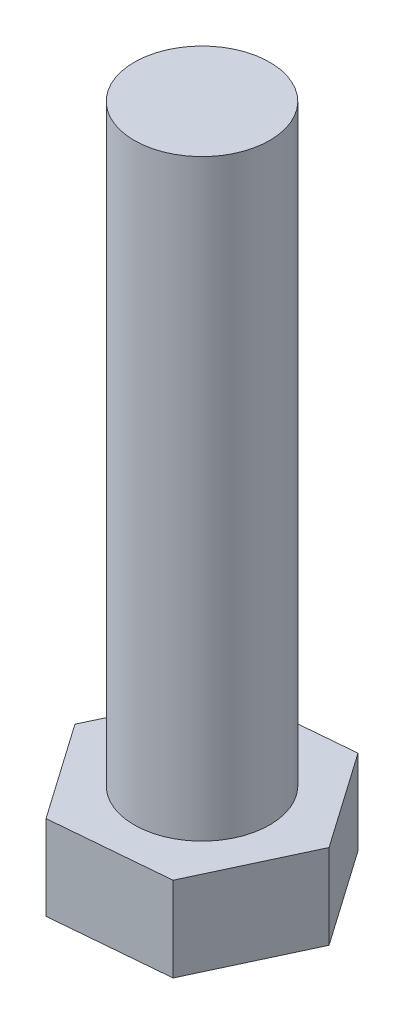
ISO-10303-21;
HEADER;
FILE_DESCRIPTION(('STEP AP214'),'2;1');
FILE_NAME('part.step','',(''),(''),'','','');
FILE_SCHEMA(('AUTOMOTIVE_DESIGN { 1 0 10303 214 1 1 1 1 }'));
ENDSEC;
DATA;
#1=APPLICATION_CONTEXT('core data for automotive mechanical design processes');
#2=APPLICATION_PROTOCOL_DEFINITION('international standard','automotive_design',2000,#1);
#3=PRODUCT_CONTEXT('',#1,'mechanical');
#4=PRODUCT('Part','Part','',(#3));
#5=PRODUCT_RELATED_PRODUCT_CATEGORY('part','',(#4));
#6=PRODUCT_DEFINITION_FORMATION('','',#4);
#7=PRODUCT_DEFINITION_CONTEXT('part definition',#1,'design');
#8=PRODUCT_DEFINITION('design','',#6,#7);
#9=PRODUCT_DEFINITION_SHAPE('','',#8);
#10=(LENGTH_UNIT() NAMED_UNIT(*) SI_UNIT(.MILLI.,.METRE.));
#11=(NAMED_UNIT(*) PLANE_ANGLE_UNIT() SI_UNIT($,.RADIAN.));
#12=(NAMED_UNIT(*) SI_UNIT($,.STERADIAN.) SOLID_ANGLE_UNIT());
#13=UNCERTAINTY_MEASURE_WITH_UNIT(LENGTH_MEASURE(1.E-05),#10,'distance_accuracy_value','');
#14=(GEOMETRIC_REPRESENTATION_CONTEXT(3) GLOBAL_UNCERTAINTY_ASSIGNED_CONTEXT((#13)) GLOBAL_UNIT_ASSIGNED_CONTEXT((#10,
#11,#12)) REPRESENTATION_CONTEXT('',''));
#15=CARTESIAN_POINT('',(0.,0.,0.));
#16=DIRECTION('',(0.,0.,1.));
#17=DIRECTION('',(1.,0.,0.));
#18=AXIS2_PLACEMENT_3D('',#15,#16,#17);
#19=CARTESIAN_POINT('',(-2.93212988476985,5.,6.27715017654027));
#20=DIRECTION('',(-0.0864980574249232,0.,-0.996252019351386));
#21=DIRECTION('',(-0.996252019351386,0.,0.0864980574249232));
#22=AXIS2_PLACEMENT_3D('',#19,#20,#21);
#23=PLANE('',#22);
#24=DIRECTION('',(0.996252019351386,0.,-0.0864980574249232));
#25=VECTOR('',#24,1.);
#26=CARTESIAN_POINT('',(-2.93212988476985,0.,6.27715017654027));
#27=LINE('',#26,#25);
#28=CARTESIAN_POINT('',(-2.93212988476985,0.,6.27715017654027));
#29=VERTEX_POINT('',#28);
#30=CARTESIAN_POINT('',(3.97010657386892,0.,5.67787405567636));
#31=VERTEX_POINT('',#30);
#32=EDGE_CURVE('E116',#29,#31,#27,.T.);
#33=ORIENTED_EDGE('',*,*,#32,.T.);
#34=DIRECTION('',(0.,-1.,0.));
#35=VECTOR('',#34,1.);
#36=CARTESIAN_POINT('',(3.97010657386892,5.,5.67787405567636));
#37=LINE('',#36,#35);
#38=CARTESIAN_POINT('',(3.97010657386892,5.,5.67787405567636));
#39=VERTEX_POINT('',#38);
#40=EDGE_CURVE('E11',#39,#31,#37,.T.);
#41=ORIENTED_EDGE('',*,*,#40,.F.);
#42=DIRECTION('',(0.996252019351386,0.,-0.0864980574249232));
#43=VECTOR('',#42,1.);
#44=CARTESIAN_POINT('',(-2.93212988476985,5.,6.27715017654027));
#45=LINE('',#44,#43);
#46=CARTESIAN_POINT('',(-2.93212988476985,5.,6.27715017654027));
#47=VERTEX_POINT('',#46);
#48=EDGE_CURVE('E127',#47,#39,#45,.T.);
#49=ORIENTED_EDGE('',*,*,#48,.F.);
#50=DIRECTION('',(0.,-1.,0.));
#51=VECTOR('',#50,1.);
#52=CARTESIAN_POINT('',(-2.93212988476985,5.,6.27715017654027));
#53=LINE('',#52,#51);
#54=EDGE_CURVE('E112',#47,#29,#53,.T.);
#55=ORIENTED_EDGE('',*,*,#54,.T.);
#56=EDGE_LOOP('',(#33,#41,#49,#55));
#57=FACE_BOUND('',#56,.T.);
#58=ADVANCED_FACE('F32',(#57),#23,.F.);
#59=CARTESIAN_POINT('',(3.97010657386892,5.,5.67787405567636));
#60=DIRECTION('',(-0.906028586042308,0.,-0.423216494567705));
#61=DIRECTION('',(-0.423216494567705,0.,0.906028586042308));
#62=AXIS2_PLACEMENT_3D('',#59,#60,#61);
#63=PLANE('',#62);
#64=DIRECTION('',(0.423216494567705,0.,-0.906028586042308));
#65=VECTOR('',#64,1.);
#66=CARTESIAN_POINT('',(3.97010657386892,0.,5.67787405567636));
#67=LINE('',#66,#65);
#68=CARTESIAN_POINT('',(6.90223645863877,0.,-0.599276120863908));
#69=VERTEX_POINT('',#68);
#70=EDGE_CURVE('E119',#31,#69,#67,.T.);
#71=ORIENTED_EDGE('',*,*,#70,.T.);
#72=DIRECTION('',(0.,-1.,0.));
#73=VECTOR('',#72,1.);
#74=CARTESIAN_POINT('',(6.90223645863877,5.,-0.599276120863908));
#75=LINE('',#74,#73);
#76=CARTESIAN_POINT('',(6.90223645863877,5.,-0.599276120863908));
#77=VERTEX_POINT('',#76);
#78=EDGE_CURVE('E40',#77,#69,#75,.T.);
#79=ORIENTED_EDGE('',*,*,#78,.F.);
#80=DIRECTION('',(0.423216494567705,0.,-0.906028586042308));
#81=VECTOR('',#80,1.);
#82=CARTESIAN_POINT('',(3.97010657386892,5.,5.67787405567636));
#83=LINE('',#82,#81);
#84=EDGE_CURVE('E85',#39,#77,#83,.T.);
#85=ORIENTED_EDGE('',*,*,#84,.F.);
#86=ORIENTED_EDGE('',*,*,#40,.T.);
#87=EDGE_LOOP('',(#71,#79,#85,#86));
#88=FACE_BOUND('',#87,.T.);
#89=ADVANCED_FACE('F152',(#88),#63,.F.);
#90=CARTESIAN_POINT('',(6.90223645863877,5.,-0.599276120863908));
#91=DIRECTION('',(-0.819530528617385,0.,0.573035524783682));
#92=DIRECTION('',(0.573035524783682,0.,0.819530528617385));
#93=AXIS2_PLACEMENT_3D('',#90,#91,#92);
#94=PLANE('',#93);
#95=DIRECTION('',(-0.573035524783682,0.,-0.819530528617385));
#96=VECTOR('',#95,1.);
#97=CARTESIAN_POINT('',(6.90223645863877,0.,-0.599276120863908));
#98=LINE('',#97,#96);
#99=CARTESIAN_POINT('',(2.93212988476985,0.,-6.27715017654027));
#100=VERTEX_POINT('',#99);
#101=EDGE_CURVE('E122',#69,#100,#98,.T.);
#102=ORIENTED_EDGE('',*,*,#101,.T.);
#103=DIRECTION('',(0.,-1.,0.));
#104=VECTOR('',#103,1.);
#105=CARTESIAN_POINT('',(2.93212988476985,5.,-6.27715017654027));
#106=LINE('',#105,#104);
#107=CARTESIAN_POINT('',(2.93212988476985,5.,-6.27715017654027));
#108=VERTEX_POINT('',#107);
#109=EDGE_CURVE('E107',#108,#100,#106,.T.);
#110=ORIENTED_EDGE('',*,*,#109,.F.);
#111=DIRECTION('',(-0.573035524783682,0.,-0.819530528617385));
#112=VECTOR('',#111,1.);
#113=CARTESIAN_POINT('',(6.90223645863877,5.,-0.599276120863908));
#114=LINE('',#113,#112);
#115=EDGE_CURVE('E98',#77,#108,#114,.T.);
#116=ORIENTED_EDGE('',*,*,#115,.F.);
#117=ORIENTED_EDGE('',*,*,#78,.T.);
#118=EDGE_LOOP('',(#102,#110,#116,#117));
#119=FACE_BOUND('',#118,.T.);
#120=ADVANCED_FACE('F133',(#119),#94,.F.);
#121=CARTESIAN_POINT('',(2.93212988476985,5.,-6.27715017654027));
#122=DIRECTION('',(0.0864980574249229,0.,0.996252019351386));
#123=DIRECTION('',(0.996252019351386,0.,-0.0864980574249229));
#124=AXIS2_PLACEMENT_3D('',#121,#122,#123);
#125=PLANE('',#124);
#126=DIRECTION('',(-0.996252019351386,0.,0.0864980574249229));
#127=VECTOR('',#126,1.);
#128=CARTESIAN_POINT('',(2.93212988476985,0.,-6.27715017654027));
#129=LINE('',#128,#127);
#130=CARTESIAN_POINT('',(-3.97010657386892,0.,-5.67787405567636));
#131=VERTEX_POINT('',#130);
#132=EDGE_CURVE('E106',#100,#131,#129,.T.);
#133=ORIENTED_EDGE('',*,*,#132,.T.);
#134=DIRECTION('',(0.,-1.,0.));
#135=VECTOR('',#134,1.);
#136=CARTESIAN_POINT('',(-3.97010657386892,5.,-5.67787405567636));
#137=LINE('',#136,#135);
#138=CARTESIAN_POINT('',(-3.97010657386892,5.,-5.67787405567636));
#139=VERTEX_POINT('',#138);
#140=EDGE_CURVE('E103',#139,#131,#137,.T.);
#141=ORIENTED_EDGE('',*,*,#140,.F.);
#142=DIRECTION('',(-0.996252019351386,0.,0.0864980574249229));
#143=VECTOR('',#142,1.);
#144=CARTESIAN_POINT('',(2.93212988476985,5.,-6.27715017654027));
#145=LINE('',#144,#143);
#146=EDGE_CURVE('E92',#108,#139,#145,.T.);
#147=ORIENTED_EDGE('',*,*,#146,.F.);
#148=ORIENTED_EDGE('',*,*,#109,.T.);
#149=EDGE_LOOP('',(#133,#141,#147,#148));
#150=FACE_BOUND('',#149,.T.);
#151=ADVANCED_FACE('F104',(#150),#125,.F.);
#152=CARTESIAN_POINT('',(-3.97010657386892,5.,-5.67787405567636));
#153=DIRECTION('',(0.906028586042308,0.,0.423216494567705));
#154=DIRECTION('',(0.423216494567705,0.,-0.906028586042308));
#155=AXIS2_PLACEMENT_3D('',#152,#153,#154);
#156=PLANE('',#155);
#157=DIRECTION('',(-0.423216494567705,0.,0.906028586042308));
#158=VECTOR('',#157,1.);
#159=CARTESIAN_POINT('',(-3.97010657386892,0.,-5.67787405567636));
#160=LINE('',#159,#158);
#161=CARTESIAN_POINT('',(-6.90223645863877,0.,0.599276120863908));
#162=VERTEX_POINT('',#161);
#163=EDGE_CURVE('E71',#131,#162,#160,.T.);
#164=ORIENTED_EDGE('',*,*,#163,.T.);
#165=DIRECTION('',(0.,-1.,0.));
#166=VECTOR('',#165,1.);
#167=CARTESIAN_POINT('',(-6.90223645863877,5.,0.599276120863908));
#168=LINE('',#167,#166);
#169=CARTESIAN_POINT('',(-6.90223645863877,5.,0.599276120863908));
#170=VERTEX_POINT('',#169);
#171=EDGE_CURVE('E108',#170,#162,#168,.T.);
#172=ORIENTED_EDGE('',*,*,#171,.F.);
#173=DIRECTION('',(-0.423216494567705,0.,0.906028586042308));
#174=VECTOR('',#173,1.);
#175=CARTESIAN_POINT('',(-3.97010657386892,5.,-5.67787405567636));
#176=LINE('',#175,#174);
#177=EDGE_CURVE('E96',#139,#170,#176,.T.);
#178=ORIENTED_EDGE('',*,*,#177,.F.);
#179=ORIENTED_EDGE('',*,*,#140,.T.);
#180=EDGE_LOOP('',(#164,#172,#178,#179));
#181=FACE_BOUND('',#180,.T.);
#182=ADVANCED_FACE('F110',(#181),#156,.F.);
#183=CARTESIAN_POINT('',(-6.90223645863877,5.,0.599276120863908));
#184=DIRECTION('',(0.819530528617385,0.,-0.573035524783682));
#185=DIRECTION('',(-0.573035524783682,0.,-0.819530528617385));
#186=AXIS2_PLACEMENT_3D('',#183,#184,#185);
#187=PLANE('',#186);
#188=DIRECTION('',(0.573035524783681,0.,0.819530528617385));
#189=VECTOR('',#188,1.);
#190=CARTESIAN_POINT('',(-6.90223645863877,0.,0.599276120863908));
#191=LINE('',#190,#189);
#192=EDGE_CURVE('E77',#162,#29,#191,.T.);
#193=ORIENTED_EDGE('',*,*,#192,.T.);
#194=ORIENTED_EDGE('',*,*,#54,.F.);
#195=DIRECTION('',(0.573035524783681,0.,0.819530528617385));
#196=VECTOR('',#195,1.);
#197=CARTESIAN_POINT('',(-6.90223645863877,5.,0.599276120863908));
#198=LINE('',#197,#196);
#199=EDGE_CURVE('E48',#170,#47,#198,.T.);
#200=ORIENTED_EDGE('',*,*,#199,.F.);
#201=ORIENTED_EDGE('',*,*,#171,.T.);
#202=EDGE_LOOP('',(#193,#194,#200,#201));
#203=FACE_BOUND('',#202,.T.);
#204=ADVANCED_FACE('F140',(#203),#187,.F.);
#205=CARTESIAN_POINT('',(0.,5.,0.));
#206=DIRECTION('',(0.,1.,0.));
#207=DIRECTION('',(0.,0.,1.));
#208=AXIS2_PLACEMENT_3D('',#205,#206,#207);
#209=PLANE('',#208);
#210=CARTESIAN_POINT('',(0.,5.,0.));
#211=DIRECTION('',(0.,1.,0.));
#212=DIRECTION('',(0.,0.,1.));
#213=AXIS2_PLACEMENT_3D('',#210,#211,#212);
#214=CIRCLE('',#213,4.);
#215=CARTESIAN_POINT('',(0.,5.,4.));
#216=VERTEX_POINT('',#215);
#217=EDGE_CURVE('E213',#216,#216,#214,.T.);
#218=ORIENTED_EDGE('',*,*,#217,.F.);
#219=EDGE_LOOP('',(#218));
#220=FACE_BOUND('',#219,.T.);
#221=ORIENTED_EDGE('',*,*,#48,.T.);
#222=ORIENTED_EDGE('',*,*,#84,.T.);
#223=ORIENTED_EDGE('',*,*,#115,.T.);
#224=ORIENTED_EDGE('',*,*,#146,.T.);
#225=ORIENTED_EDGE('',*,*,#177,.T.);
#226=ORIENTED_EDGE('',*,*,#199,.T.);
#227=EDGE_LOOP('',(#221,#222,#223,#224,#225,#226));
#228=FACE_BOUND('',#227,.T.);
#229=ADVANCED_FACE('F94',(#220,#228),#209,.T.);
#230=CARTESIAN_POINT('',(0.,0.,0.));
#231=DIRECTION('',(0.,1.,0.));
#232=DIRECTION('',(0.,0.,1.));
#233=AXIS2_PLACEMENT_3D('',#230,#231,#232);
#234=PLANE('',#233);
#235=ORIENTED_EDGE('',*,*,#32,.F.);
#236=ORIENTED_EDGE('',*,*,#192,.F.);
#237=ORIENTED_EDGE('',*,*,#163,.F.);
#238=ORIENTED_EDGE('',*,*,#132,.F.);
#239=ORIENTED_EDGE('',*,*,#101,.F.);
#240=ORIENTED_EDGE('',*,*,#70,.F.);
#241=EDGE_LOOP('',(#235,#236,#237,#238,#239,#240));
#242=FACE_BOUND('',#241,.T.);
#243=ADVANCED_FACE('F136',(#242),#234,.F.);
#244=CARTESIAN_POINT('',(0.,40.,0.));
#245=DIRECTION('',(0.,-1.,0.));
#246=DIRECTION('',(0.,0.,-1.));
#247=AXIS2_PLACEMENT_3D('',#244,#245,#246);
#248=CYLINDRICAL_SURFACE('',#247,4.);
#249=CARTESIAN_POINT('',(0.,40.,0.));
#250=DIRECTION('',(0.,1.,0.));
#251=DIRECTION('',(0.,0.,1.));
#252=AXIS2_PLACEMENT_3D('',#249,#250,#251);
#253=CIRCLE('',#252,4.);
#254=CARTESIAN_POINT('',(0.,40.,4.));
#255=VERTEX_POINT('',#254);
#256=EDGE_CURVE('E120',#255,#255,#253,.T.);
#257=ORIENTED_EDGE('',*,*,#256,.F.);
#258=EDGE_LOOP('',(#257));
#259=FACE_BOUND('',#258,.T.);
#260=ORIENTED_EDGE('',*,*,#217,.T.);
#261=EDGE_LOOP('',(#260));
#262=FACE_BOUND('',#261,.T.);
#263=ADVANCED_FACE('F184',(#259,#262),#248,.T.);
#264=CARTESIAN_POINT('',(0.,40.,0.));
#265=DIRECTION('',(0.,1.,0.));
#266=DIRECTION('',(0.,0.,1.));
#267=AXIS2_PLACEMENT_3D('',#264,#265,#266);
#268=PLANE('',#267);
#269=ORIENTED_EDGE('',*,*,#256,.T.);
#270=EDGE_LOOP('',(#269));
#271=FACE_BOUND('',#270,.T.);
#272=ADVANCED_FACE('F197',(#271),#268,.T.);
#273=CLOSED_SHELL('',(#58,#89,#120,#151,#182,#204,#229,#243,#263,#272));
#274=MANIFOLD_SOLID_BREP('B2',#273);
#275=ADVANCED_BREP_SHAPE_REPRESENTATION('',(#18,#274),#14);
#276=SHAPE_DEFINITION_REPRESENTATION(#9,#275);
ENDSEC;
END-ISO-10303-21;
